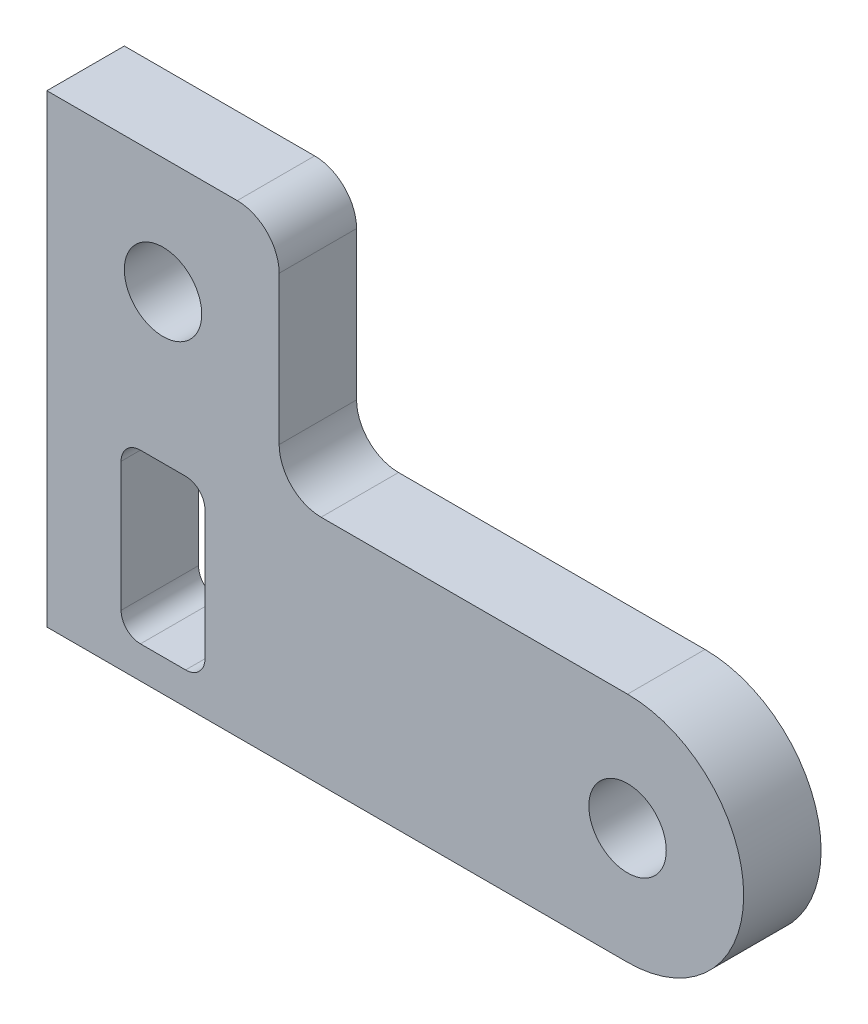
ISO-10303-21;
HEADER;
FILE_DESCRIPTION(('STEP AP214'),'2;1');
FILE_NAME('part.step','',(''),(''),'','','');
FILE_SCHEMA(('AUTOMOTIVE_DESIGN { 1 0 10303 214 1 1 1 1 }'));
ENDSEC;
DATA;
#1=APPLICATION_CONTEXT('core data for automotive mechanical design processes');
#2=APPLICATION_PROTOCOL_DEFINITION('international standard','automotive_design',2000,#1);
#3=PRODUCT_CONTEXT('',#1,'mechanical');
#4=PRODUCT('Part','Part','',(#3));
#5=PRODUCT_RELATED_PRODUCT_CATEGORY('part','',(#4));
#6=PRODUCT_DEFINITION_FORMATION('','',#4);
#7=PRODUCT_DEFINITION_CONTEXT('part definition',#1,'design');
#8=PRODUCT_DEFINITION('design','',#6,#7);
#9=PRODUCT_DEFINITION_SHAPE('','',#8);
#10=(LENGTH_UNIT() NAMED_UNIT(*) SI_UNIT(.MILLI.,.METRE.));
#11=(NAMED_UNIT(*) PLANE_ANGLE_UNIT() SI_UNIT($,.RADIAN.));
#12=(NAMED_UNIT(*) SI_UNIT($,.STERADIAN.) SOLID_ANGLE_UNIT());
#13=UNCERTAINTY_MEASURE_WITH_UNIT(LENGTH_MEASURE(1.E-05),#10,'distance_accuracy_value','');
#14=(GEOMETRIC_REPRESENTATION_CONTEXT(3) GLOBAL_UNCERTAINTY_ASSIGNED_CONTEXT((#13)) GLOBAL_UNIT_ASSIGNED_CONTEXT((#10,
#11,#12)) REPRESENTATION_CONTEXT('',''));
#15=CARTESIAN_POINT('',(0.,0.,0.));
#16=DIRECTION('',(0.,0.,1.));
#17=DIRECTION('',(1.,0.,0.));
#18=AXIS2_PLACEMENT_3D('',#15,#16,#17);
#19=CARTESIAN_POINT('',(201.0978533093,269.1465473352,3.));
#20=DIRECTION('',(0.,0.,1.));
#21=DIRECTION('',(1.,0.,0.));
#22=AXIS2_PLACEMENT_3D('',#19,#20,#21);
#23=PLANE('',#22);
#24=DIRECTION('',(1.,0.,0.));
#25=VECTOR('',#24,1.);
#26=CARTESIAN_POINT('',(182.2228533093,265.8965473352,3.));
#27=LINE('',#26,#25);
#28=CARTESIAN_POINT('',(182.2228533093,265.8965473352,3.));
#29=VERTEX_POINT('',#28);
#30=CARTESIAN_POINT('',(183.9728533093,265.8965473352,3.));
#31=VERTEX_POINT('',#30);
#32=EDGE_CURVE('E154',#29,#31,#27,.T.);
#33=ORIENTED_EDGE('',*,*,#32,.F.);
#34=CARTESIAN_POINT('',(182.2228533093,266.6465473352,3.));
#35=DIRECTION('',(0.,0.,1.));
#36=DIRECTION('',(1.,0.,0.));
#37=AXIS2_PLACEMENT_3D('',#34,#35,#36);
#38=CIRCLE('',#37,0.749999999999987);
#39=CARTESIAN_POINT('',(181.4728533093,266.6465473352,3.));
#40=VERTEX_POINT('',#39);
#41=EDGE_CURVE('E146',#40,#29,#38,.T.);
#42=ORIENTED_EDGE('',*,*,#41,.F.);
#43=DIRECTION('',(0.,-1.,0.));
#44=VECTOR('',#43,1.);
#45=CARTESIAN_POINT('',(181.4728533093,271.6465473352,3.));
#46=LINE('',#45,#44);
#47=CARTESIAN_POINT('',(181.4728533093,271.6465473352,3.));
#48=VERTEX_POINT('',#47);
#49=EDGE_CURVE('E181',#48,#40,#46,.T.);
#50=ORIENTED_EDGE('',*,*,#49,.F.);
#51=CARTESIAN_POINT('',(182.2228533093,271.6465473352,3.));
#52=DIRECTION('',(0.,0.,1.));
#53=DIRECTION('',(1.,0.,0.));
#54=AXIS2_PLACEMENT_3D('',#51,#52,#53);
#55=CIRCLE('',#54,0.750000000000015);
#56=CARTESIAN_POINT('',(182.2228533093,272.3965473352,3.));
#57=VERTEX_POINT('',#56);
#58=EDGE_CURVE('E179',#57,#48,#55,.T.);
#59=ORIENTED_EDGE('',*,*,#58,.F.);
#60=DIRECTION('',(-1.,0.,0.));
#61=VECTOR('',#60,1.);
#62=CARTESIAN_POINT('',(183.9728533093,272.3965473352,3.));
#63=LINE('',#62,#61);
#64=CARTESIAN_POINT('',(183.9728533093,272.3965473352,3.));
#65=VERTEX_POINT('',#64);
#66=EDGE_CURVE('E177',#65,#57,#63,.T.);
#67=ORIENTED_EDGE('',*,*,#66,.F.);
#68=CARTESIAN_POINT('',(183.9728533093,271.6465473352,3.));
#69=DIRECTION('',(0.,0.,1.));
#70=DIRECTION('',(1.,0.,0.));
#71=AXIS2_PLACEMENT_3D('',#68,#69,#70);
#72=CIRCLE('',#71,0.750000000000015);
#73=CARTESIAN_POINT('',(184.7228533093,271.6465473352,3.));
#74=VERTEX_POINT('',#73);
#75=EDGE_CURVE('E175',#74,#65,#72,.T.);
#76=ORIENTED_EDGE('',*,*,#75,.F.);
#77=DIRECTION('',(0.,1.,0.));
#78=VECTOR('',#77,1.);
#79=CARTESIAN_POINT('',(184.7228533093,266.6465473352,3.));
#80=LINE('',#79,#78);
#81=CARTESIAN_POINT('',(184.7228533093,266.6465473352,3.));
#82=VERTEX_POINT('',#81);
#83=EDGE_CURVE('E170',#82,#74,#80,.T.);
#84=ORIENTED_EDGE('',*,*,#83,.F.);
#85=CARTESIAN_POINT('',(183.9728533093,266.6465473352,3.));
#86=DIRECTION('',(0.,0.,1.));
#87=DIRECTION('',(1.,0.,0.));
#88=AXIS2_PLACEMENT_3D('',#85,#86,#87);
#89=CIRCLE('',#88,0.749999999999987);
#90=EDGE_CURVE('E168',#31,#82,#89,.T.);
#91=ORIENTED_EDGE('',*,*,#90,.F.);
#92=EDGE_LOOP('',(#33,#42,#50,#59,#67,#76,#84,#91));
#93=FACE_BOUND('',#92,.T.);
#94=CARTESIAN_POINT('',(201.0978533093,269.1465473352,3.));
#95=DIRECTION('',(0.,0.,1.));
#96=DIRECTION('',(1.,0.,0.));
#97=AXIS2_PLACEMENT_3D('',#94,#95,#96);
#98=CIRCLE('',#97,4.49999999999998);
#99=CARTESIAN_POINT('',(201.0978533093,264.6465473352,3.));
#100=VERTEX_POINT('',#99);
#101=CARTESIAN_POINT('',(201.0978533093,273.6465473352,3.));
#102=VERTEX_POINT('',#101);
#103=EDGE_CURVE('E220',#100,#102,#98,.T.);
#104=ORIENTED_EDGE('',*,*,#103,.T.);
#105=DIRECTION('',(-1.,0.,0.));
#106=VECTOR('',#105,1.);
#107=CARTESIAN_POINT('',(189.2228533093,273.6465473352,3.));
#108=LINE('',#107,#106);
#109=CARTESIAN_POINT('',(189.2228533093,273.6465473352,3.));
#110=VERTEX_POINT('',#109);
#111=EDGE_CURVE('E223',#102,#110,#108,.T.);
#112=ORIENTED_EDGE('',*,*,#111,.T.);
#113=CARTESIAN_POINT('',(189.2228533093,275.2715473352,3.));
#114=DIRECTION('',(0.,0.,-1.));
#115=DIRECTION('',(1.,0.,0.));
#116=AXIS2_PLACEMENT_3D('',#113,#114,#115);
#117=CIRCLE('',#116,1.62500000000002);
#118=CARTESIAN_POINT('',(187.5978533093,275.2715473352,3.));
#119=VERTEX_POINT('',#118);
#120=EDGE_CURVE('E226',#110,#119,#117,.T.);
#121=ORIENTED_EDGE('',*,*,#120,.T.);
#122=DIRECTION('',(0.,1.,0.));
#123=VECTOR('',#122,1.);
#124=CARTESIAN_POINT('',(187.5978533093,281.0215473352,3.));
#125=LINE('',#124,#123);
#126=CARTESIAN_POINT('',(187.5978533093,281.0215473352,3.));
#127=VERTEX_POINT('',#126);
#128=EDGE_CURVE('E228',#119,#127,#125,.T.);
#129=ORIENTED_EDGE('',*,*,#128,.T.);
#130=CARTESIAN_POINT('',(185.9728533093,281.0215473352,3.));
#131=DIRECTION('',(0.,0.,1.));
#132=DIRECTION('',(1.,0.,0.));
#133=AXIS2_PLACEMENT_3D('',#130,#131,#132);
#134=CIRCLE('',#133,1.62499999999999);
#135=CARTESIAN_POINT('',(185.9728533093,282.6465473352,3.));
#136=VERTEX_POINT('',#135);
#137=EDGE_CURVE('E230',#127,#136,#134,.T.);
#138=ORIENTED_EDGE('',*,*,#137,.T.);
#139=DIRECTION('',(-1.,0.,0.));
#140=VECTOR('',#139,1.);
#141=CARTESIAN_POINT('',(185.9728533093,282.6465473352,3.));
#142=LINE('',#141,#140);
#143=CARTESIAN_POINT('',(178.5978533093,282.6465473352,3.));
#144=VERTEX_POINT('',#143);
#145=EDGE_CURVE('E232',#136,#144,#142,.T.);
#146=ORIENTED_EDGE('',*,*,#145,.T.);
#147=DIRECTION('',(0.,-1.,0.));
#148=VECTOR('',#147,1.);
#149=CARTESIAN_POINT('',(178.5978533093,282.6465473352,3.));
#150=LINE('',#149,#148);
#151=CARTESIAN_POINT('',(178.5978533093,264.6465473352,3.));
#152=VERTEX_POINT('',#151);
#153=EDGE_CURVE('E234',#144,#152,#150,.T.);
#154=ORIENTED_EDGE('',*,*,#153,.T.);
#155=DIRECTION('',(1.,0.,0.));
#156=VECTOR('',#155,1.);
#157=CARTESIAN_POINT('',(201.0978533093,264.6465473352,3.));
#158=LINE('',#157,#156);
#159=EDGE_CURVE('E236',#152,#100,#158,.T.);
#160=ORIENTED_EDGE('',*,*,#159,.T.);
#161=EDGE_LOOP('',(#104,#112,#121,#129,#138,#146,#154,#160));
#162=FACE_BOUND('',#161,.T.);
#163=CARTESIAN_POINT('',(201.0978533093,269.1465473352,3.));
#164=DIRECTION('',(0.,0.,1.));
#165=DIRECTION('',(1.,0.,0.));
#166=AXIS2_PLACEMENT_3D('',#163,#164,#165);
#167=CIRCLE('',#166,1.5);
#168=CARTESIAN_POINT('',(202.5978533093,269.1465473352,3.));
#169=VERTEX_POINT('',#168);
#170=EDGE_CURVE('E214',#169,#169,#167,.T.);
#171=ORIENTED_EDGE('',*,*,#170,.F.);
#172=EDGE_LOOP('',(#171));
#173=FACE_BOUND('',#172,.T.);
#174=CARTESIAN_POINT('',(183.0978533093,278.1459687639,3.));
#175=DIRECTION('',(0.,0.,1.));
#176=DIRECTION('',(1.,0.,0.));
#177=AXIS2_PLACEMENT_3D('',#174,#175,#176);
#178=CIRCLE('',#177,1.5);
#179=CARTESIAN_POINT('',(184.5978533093,278.1459687639,3.));
#180=VERTEX_POINT('',#179);
#181=EDGE_CURVE('E184',#180,#180,#178,.T.);
#182=ORIENTED_EDGE('',*,*,#181,.F.);
#183=EDGE_LOOP('',(#182));
#184=FACE_BOUND('',#183,.T.);
#185=ADVANCED_FACE('F33',(#93,#162,#173,#184),#23,.T.);
#186=CARTESIAN_POINT('',(201.0978533093,269.1465473352,0.));
#187=DIRECTION('',(0.,0.,1.));
#188=DIRECTION('',(1.,0.,0.));
#189=AXIS2_PLACEMENT_3D('',#186,#187,#188);
#190=PLANE('',#189);
#191=CARTESIAN_POINT('',(182.2228533093,266.6465473352,0.));
#192=DIRECTION('',(0.,0.,1.));
#193=DIRECTION('',(1.,0.,0.));
#194=AXIS2_PLACEMENT_3D('',#191,#192,#193);
#195=CIRCLE('',#194,0.749999999999987);
#196=CARTESIAN_POINT('',(181.4728533093,266.6465473352,0.));
#197=VERTEX_POINT('',#196);
#198=CARTESIAN_POINT('',(182.2228533093,265.8965473352,0.));
#199=VERTEX_POINT('',#198);
#200=EDGE_CURVE('E56',#197,#199,#195,.T.);
#201=ORIENTED_EDGE('',*,*,#200,.T.);
#202=DIRECTION('',(1.,0.,0.));
#203=VECTOR('',#202,1.);
#204=CARTESIAN_POINT('',(182.2228533093,265.8965473352,0.));
#205=LINE('',#204,#203);
#206=CARTESIAN_POINT('',(183.9728533093,265.8965473352,0.));
#207=VERTEX_POINT('',#206);
#208=EDGE_CURVE('E161',#199,#207,#205,.T.);
#209=ORIENTED_EDGE('',*,*,#208,.T.);
#210=CARTESIAN_POINT('',(183.9728533093,266.6465473352,0.));
#211=DIRECTION('',(0.,0.,1.));
#212=DIRECTION('',(1.,0.,0.));
#213=AXIS2_PLACEMENT_3D('',#210,#211,#212);
#214=CIRCLE('',#213,0.749999999999987);
#215=CARTESIAN_POINT('',(184.7228533093,266.6465473352,0.));
#216=VERTEX_POINT('',#215);
#217=EDGE_CURVE('E186',#207,#216,#214,.T.);
#218=ORIENTED_EDGE('',*,*,#217,.T.);
#219=DIRECTION('',(0.,1.,0.));
#220=VECTOR('',#219,1.);
#221=CARTESIAN_POINT('',(184.7228533093,266.6465473352,0.));
#222=LINE('',#221,#220);
#223=CARTESIAN_POINT('',(184.7228533093,271.6465473352,0.));
#224=VERTEX_POINT('',#223);
#225=EDGE_CURVE('E189',#216,#224,#222,.T.);
#226=ORIENTED_EDGE('',*,*,#225,.T.);
#227=CARTESIAN_POINT('',(183.9728533093,271.6465473352,0.));
#228=DIRECTION('',(0.,0.,1.));
#229=DIRECTION('',(1.,0.,0.));
#230=AXIS2_PLACEMENT_3D('',#227,#228,#229);
#231=CIRCLE('',#230,0.750000000000015);
#232=CARTESIAN_POINT('',(183.9728533093,272.3965473352,0.));
#233=VERTEX_POINT('',#232);
#234=EDGE_CURVE('E192',#224,#233,#231,.T.);
#235=ORIENTED_EDGE('',*,*,#234,.T.);
#236=DIRECTION('',(-1.,0.,0.));
#237=VECTOR('',#236,1.);
#238=CARTESIAN_POINT('',(183.9728533093,272.3965473352,0.));
#239=LINE('',#238,#237);
#240=CARTESIAN_POINT('',(182.2228533093,272.3965473352,0.));
#241=VERTEX_POINT('',#240);
#242=EDGE_CURVE('E195',#233,#241,#239,.T.);
#243=ORIENTED_EDGE('',*,*,#242,.T.);
#244=CARTESIAN_POINT('',(182.2228533093,271.6465473352,0.));
#245=DIRECTION('',(0.,0.,1.));
#246=DIRECTION('',(1.,0.,0.));
#247=AXIS2_PLACEMENT_3D('',#244,#245,#246);
#248=CIRCLE('',#247,0.750000000000015);
#249=CARTESIAN_POINT('',(181.4728533093,271.6465473352,0.));
#250=VERTEX_POINT('',#249);
#251=EDGE_CURVE('E198',#241,#250,#248,.T.);
#252=ORIENTED_EDGE('',*,*,#251,.T.);
#253=DIRECTION('',(0.,-1.,0.));
#254=VECTOR('',#253,1.);
#255=CARTESIAN_POINT('',(181.4728533093,271.6465473352,0.));
#256=LINE('',#255,#254);
#257=EDGE_CURVE('E155',#250,#197,#256,.T.);
#258=ORIENTED_EDGE('',*,*,#257,.T.);
#259=EDGE_LOOP('',(#201,#209,#218,#226,#235,#243,#252,#258));
#260=FACE_BOUND('',#259,.T.);
#261=CARTESIAN_POINT('',(201.0978533093,269.1465473352,0.));
#262=DIRECTION('',(0.,0.,1.));
#263=DIRECTION('',(1.,0.,0.));
#264=AXIS2_PLACEMENT_3D('',#261,#262,#263);
#265=CIRCLE('',#264,4.49999999999998);
#266=CARTESIAN_POINT('',(201.0978533093,264.6465473352,0.));
#267=VERTEX_POINT('',#266);
#268=CARTESIAN_POINT('',(201.0978533093,273.6465473352,0.));
#269=VERTEX_POINT('',#268);
#270=EDGE_CURVE('E217',#267,#269,#265,.T.);
#271=ORIENTED_EDGE('',*,*,#270,.F.);
#272=DIRECTION('',(1.,0.,0.));
#273=VECTOR('',#272,1.);
#274=CARTESIAN_POINT('',(201.0978533093,264.6465473352,0.));
#275=LINE('',#274,#273);
#276=CARTESIAN_POINT('',(178.5978533093,264.6465473352,0.));
#277=VERTEX_POINT('',#276);
#278=EDGE_CURVE('E224',#277,#267,#275,.T.);
#279=ORIENTED_EDGE('',*,*,#278,.F.);
#280=DIRECTION('',(0.,-1.,0.));
#281=VECTOR('',#280,1.);
#282=CARTESIAN_POINT('',(178.5978533093,282.6465473352,0.));
#283=LINE('',#282,#281);
#284=CARTESIAN_POINT('',(178.5978533093,282.6465473352,0.));
#285=VERTEX_POINT('',#284);
#286=EDGE_CURVE('E251',#285,#277,#283,.T.);
#287=ORIENTED_EDGE('',*,*,#286,.F.);
#288=DIRECTION('',(-1.,0.,0.));
#289=VECTOR('',#288,1.);
#290=CARTESIAN_POINT('',(185.9728533093,282.6465473352,0.));
#291=LINE('',#290,#289);
#292=CARTESIAN_POINT('',(185.9728533093,282.6465473352,0.));
#293=VERTEX_POINT('',#292);
#294=EDGE_CURVE('E249',#293,#285,#291,.T.);
#295=ORIENTED_EDGE('',*,*,#294,.F.);
#296=CARTESIAN_POINT('',(185.9728533093,281.0215473352,0.));
#297=DIRECTION('',(0.,0.,1.));
#298=DIRECTION('',(1.,0.,0.));
#299=AXIS2_PLACEMENT_3D('',#296,#297,#298);
#300=CIRCLE('',#299,1.62499999999999);
#301=CARTESIAN_POINT('',(187.5978533093,281.0215473352,0.));
#302=VERTEX_POINT('',#301);
#303=EDGE_CURVE('E247',#302,#293,#300,.T.);
#304=ORIENTED_EDGE('',*,*,#303,.F.);
#305=DIRECTION('',(0.,1.,0.));
#306=VECTOR('',#305,1.);
#307=CARTESIAN_POINT('',(187.5978533093,281.0215473352,0.));
#308=LINE('',#307,#306);
#309=CARTESIAN_POINT('',(187.5978533093,275.2715473352,0.));
#310=VERTEX_POINT('',#309);
#311=EDGE_CURVE('E245',#310,#302,#308,.T.);
#312=ORIENTED_EDGE('',*,*,#311,.F.);
#313=CARTESIAN_POINT('',(189.2228533093,275.2715473352,0.));
#314=DIRECTION('',(0.,0.,-1.));
#315=DIRECTION('',(1.,0.,0.));
#316=AXIS2_PLACEMENT_3D('',#313,#314,#315);
#317=CIRCLE('',#316,1.62500000000002);
#318=CARTESIAN_POINT('',(189.2228533093,273.6465473352,0.));
#319=VERTEX_POINT('',#318);
#320=EDGE_CURVE('E243',#319,#310,#317,.T.);
#321=ORIENTED_EDGE('',*,*,#320,.F.);
#322=DIRECTION('',(-1.,0.,0.));
#323=VECTOR('',#322,1.);
#324=CARTESIAN_POINT('',(189.2228533093,273.6465473352,0.));
#325=LINE('',#324,#323);
#326=EDGE_CURVE('E241',#269,#319,#325,.T.);
#327=ORIENTED_EDGE('',*,*,#326,.F.);
#328=EDGE_LOOP('',(#271,#279,#287,#295,#304,#312,#321,#327));
#329=FACE_BOUND('',#328,.T.);
#330=CARTESIAN_POINT('',(201.0978533093,269.1465473352,0.));
#331=DIRECTION('',(0.,0.,1.));
#332=DIRECTION('',(1.,0.,0.));
#333=AXIS2_PLACEMENT_3D('',#330,#331,#332);
#334=CIRCLE('',#333,1.5);
#335=CARTESIAN_POINT('',(202.5978533093,269.1465473352,0.));
#336=VERTEX_POINT('',#335);
#337=EDGE_CURVE('E162',#336,#336,#334,.T.);
#338=ORIENTED_EDGE('',*,*,#337,.T.);
#339=EDGE_LOOP('',(#338));
#340=FACE_BOUND('',#339,.T.);
#341=CARTESIAN_POINT('',(183.0978533093,278.1459687639,0.));
#342=DIRECTION('',(0.,0.,1.));
#343=DIRECTION('',(1.,0.,0.));
#344=AXIS2_PLACEMENT_3D('',#341,#342,#343);
#345=CIRCLE('',#344,1.5);
#346=CARTESIAN_POINT('',(184.5978533093,278.1459687639,0.));
#347=VERTEX_POINT('',#346);
#348=EDGE_CURVE('E345',#347,#347,#345,.T.);
#349=ORIENTED_EDGE('',*,*,#348,.T.);
#350=EDGE_LOOP('',(#349));
#351=FACE_BOUND('',#350,.T.);
#352=ADVANCED_FACE('F281',(#260,#329,#340,#351),#190,.F.);
#353=CARTESIAN_POINT('',(201.0978533093,269.1465473352,3.));
#354=DIRECTION('',(0.,0.,-1.));
#355=DIRECTION('',(-1.,0.,0.));
#356=AXIS2_PLACEMENT_3D('',#353,#354,#355);
#357=CYLINDRICAL_SURFACE('',#356,4.49999999999998);
#358=ORIENTED_EDGE('',*,*,#270,.T.);
#359=DIRECTION('',(0.,0.,-1.));
#360=VECTOR('',#359,1.);
#361=CARTESIAN_POINT('',(201.0978533093,273.6465473352,3.));
#362=LINE('',#361,#360);
#363=EDGE_CURVE('E11',#102,#269,#362,.T.);
#364=ORIENTED_EDGE('',*,*,#363,.F.);
#365=ORIENTED_EDGE('',*,*,#103,.F.);
#366=DIRECTION('',(0.,0.,-1.));
#367=VECTOR('',#366,1.);
#368=CARTESIAN_POINT('',(201.0978533093,264.6465473352,3.));
#369=LINE('',#368,#367);
#370=EDGE_CURVE('E238',#100,#267,#369,.T.);
#371=ORIENTED_EDGE('',*,*,#370,.T.);
#372=EDGE_LOOP('',(#358,#364,#365,#371));
#373=FACE_BOUND('',#372,.T.);
#374=ADVANCED_FACE('F35',(#373),#357,.T.);
#375=CARTESIAN_POINT('',(189.2228533093,273.6465473352,3.));
#376=DIRECTION('',(0.,-1.,0.));
#377=DIRECTION('',(0.,0.,-1.));
#378=AXIS2_PLACEMENT_3D('',#375,#376,#377);
#379=PLANE('',#378);
#380=ORIENTED_EDGE('',*,*,#326,.T.);
#381=DIRECTION('',(0.,0.,-1.));
#382=VECTOR('',#381,1.);
#383=CARTESIAN_POINT('',(189.2228533093,273.6465473352,3.));
#384=LINE('',#383,#382);
#385=EDGE_CURVE('E41',#110,#319,#384,.T.);
#386=ORIENTED_EDGE('',*,*,#385,.F.);
#387=ORIENTED_EDGE('',*,*,#111,.F.);
#388=ORIENTED_EDGE('',*,*,#363,.T.);
#389=EDGE_LOOP('',(#380,#386,#387,#388));
#390=FACE_BOUND('',#389,.T.);
#391=ADVANCED_FACE('F298',(#390),#379,.F.);
#392=CARTESIAN_POINT('',(189.2228533093,275.2715473352,3.));
#393=DIRECTION('',(0.,0.,-1.));
#394=DIRECTION('',(-1.,0.,0.));
#395=AXIS2_PLACEMENT_3D('',#392,#393,#394);
#396=CYLINDRICAL_SURFACE('',#395,1.62500000000002);
#397=ORIENTED_EDGE('',*,*,#320,.T.);
#398=DIRECTION('',(0.,0.,-1.));
#399=VECTOR('',#398,1.);
#400=CARTESIAN_POINT('',(187.5978533093,275.2715473352,3.));
#401=LINE('',#400,#399);
#402=EDGE_CURVE('E268',#119,#310,#401,.T.);
#403=ORIENTED_EDGE('',*,*,#402,.F.);
#404=ORIENTED_EDGE('',*,*,#120,.F.);
#405=ORIENTED_EDGE('',*,*,#385,.T.);
#406=EDGE_LOOP('',(#397,#403,#404,#405));
#407=FACE_BOUND('',#406,.T.);
#408=ADVANCED_FACE('F275',(#407),#396,.F.);
#409=CARTESIAN_POINT('',(187.5978533093,281.0215473352,3.));
#410=DIRECTION('',(-1.,0.,0.));
#411=DIRECTION('',(0.,0.,1.));
#412=AXIS2_PLACEMENT_3D('',#409,#410,#411);
#413=PLANE('',#412);
#414=ORIENTED_EDGE('',*,*,#311,.T.);
#415=DIRECTION('',(0.,0.,-1.));
#416=VECTOR('',#415,1.);
#417=CARTESIAN_POINT('',(187.5978533093,281.0215473352,3.));
#418=LINE('',#417,#416);
#419=EDGE_CURVE('E265',#127,#302,#418,.T.);
#420=ORIENTED_EDGE('',*,*,#419,.F.);
#421=ORIENTED_EDGE('',*,*,#128,.F.);
#422=ORIENTED_EDGE('',*,*,#402,.T.);
#423=EDGE_LOOP('',(#414,#420,#421,#422));
#424=FACE_BOUND('',#423,.T.);
#425=ADVANCED_FACE('F287',(#424),#413,.F.);
#426=CARTESIAN_POINT('',(185.9728533093,281.0215473352,3.));
#427=DIRECTION('',(0.,0.,-1.));
#428=DIRECTION('',(-1.,0.,0.));
#429=AXIS2_PLACEMENT_3D('',#426,#427,#428);
#430=CYLINDRICAL_SURFACE('',#429,1.62499999999999);
#431=ORIENTED_EDGE('',*,*,#303,.T.);
#432=DIRECTION('',(0.,0.,-1.));
#433=VECTOR('',#432,1.);
#434=CARTESIAN_POINT('',(185.9728533093,282.6465473352,3.));
#435=LINE('',#434,#433);
#436=EDGE_CURVE('E262',#136,#293,#435,.T.);
#437=ORIENTED_EDGE('',*,*,#436,.F.);
#438=ORIENTED_EDGE('',*,*,#137,.F.);
#439=ORIENTED_EDGE('',*,*,#419,.T.);
#440=EDGE_LOOP('',(#431,#437,#438,#439));
#441=FACE_BOUND('',#440,.T.);
#442=ADVANCED_FACE('F291',(#441),#430,.T.);
#443=CARTESIAN_POINT('',(185.9728533093,282.6465473352,3.));
#444=DIRECTION('',(0.,-1.,0.));
#445=DIRECTION('',(0.,0.,-1.));
#446=AXIS2_PLACEMENT_3D('',#443,#444,#445);
#447=PLANE('',#446);
#448=ORIENTED_EDGE('',*,*,#294,.T.);
#449=DIRECTION('',(0.,0.,-1.));
#450=VECTOR('',#449,1.);
#451=CARTESIAN_POINT('',(178.5978533093,282.6465473352,3.));
#452=LINE('',#451,#450);
#453=EDGE_CURVE('E259',#144,#285,#452,.T.);
#454=ORIENTED_EDGE('',*,*,#453,.F.);
#455=ORIENTED_EDGE('',*,*,#145,.F.);
#456=ORIENTED_EDGE('',*,*,#436,.T.);
#457=EDGE_LOOP('',(#448,#454,#455,#456));
#458=FACE_BOUND('',#457,.T.);
#459=ADVANCED_FACE('F311',(#458),#447,.F.);
#460=CARTESIAN_POINT('',(178.5978533093,282.6465473352,3.));
#461=DIRECTION('',(1.,0.,0.));
#462=DIRECTION('',(0.,0.,-1.));
#463=AXIS2_PLACEMENT_3D('',#460,#461,#462);
#464=PLANE('',#463);
#465=ORIENTED_EDGE('',*,*,#286,.T.);
#466=DIRECTION('',(0.,0.,-1.));
#467=VECTOR('',#466,1.);
#468=CARTESIAN_POINT('',(178.5978533093,264.6465473352,3.));
#469=LINE('',#468,#467);
#470=EDGE_CURVE('E256',#152,#277,#469,.T.);
#471=ORIENTED_EDGE('',*,*,#470,.F.);
#472=ORIENTED_EDGE('',*,*,#153,.F.);
#473=ORIENTED_EDGE('',*,*,#453,.T.);
#474=EDGE_LOOP('',(#465,#471,#472,#473));
#475=FACE_BOUND('',#474,.T.);
#476=ADVANCED_FACE('F309',(#475),#464,.F.);
#477=CARTESIAN_POINT('',(201.0978533093,264.6465473352,3.));
#478=DIRECTION('',(0.,1.,0.));
#479=DIRECTION('',(0.,0.,1.));
#480=AXIS2_PLACEMENT_3D('',#477,#478,#479);
#481=PLANE('',#480);
#482=ORIENTED_EDGE('',*,*,#278,.T.);
#483=ORIENTED_EDGE('',*,*,#370,.F.);
#484=ORIENTED_EDGE('',*,*,#159,.F.);
#485=ORIENTED_EDGE('',*,*,#470,.T.);
#486=EDGE_LOOP('',(#482,#483,#484,#485));
#487=FACE_BOUND('',#486,.T.);
#488=ADVANCED_FACE('F304',(#487),#481,.F.);
#489=CARTESIAN_POINT('',(201.0978533093,269.1465473352,3.));
#490=DIRECTION('',(0.,0.,-1.));
#491=DIRECTION('',(-1.,0.,0.));
#492=AXIS2_PLACEMENT_3D('',#489,#490,#491);
#493=CYLINDRICAL_SURFACE('',#492,1.5);
#494=ORIENTED_EDGE('',*,*,#170,.T.);
#495=EDGE_LOOP('',(#494));
#496=FACE_BOUND('',#495,.T.);
#497=ORIENTED_EDGE('',*,*,#337,.F.);
#498=EDGE_LOOP('',(#497));
#499=FACE_BOUND('',#498,.T.);
#500=ADVANCED_FACE('F328',(#496,#499),#493,.F.);
#501=CARTESIAN_POINT('',(182.2228533093,266.6465473352,3.));
#502=DIRECTION('',(0.,0.,-1.));
#503=DIRECTION('',(-1.,0.,0.));
#504=AXIS2_PLACEMENT_3D('',#501,#502,#503);
#505=CYLINDRICAL_SURFACE('',#504,0.749999999999987);
#506=ORIENTED_EDGE('',*,*,#200,.F.);
#507=DIRECTION('',(0.,0.,-1.));
#508=VECTOR('',#507,1.);
#509=CARTESIAN_POINT('',(181.4728533093,266.6465473352,3.));
#510=LINE('',#509,#508);
#511=EDGE_CURVE('E150',#40,#197,#510,.T.);
#512=ORIENTED_EDGE('',*,*,#511,.F.);
#513=ORIENTED_EDGE('',*,*,#41,.T.);
#514=DIRECTION('',(0.,0.,-1.));
#515=VECTOR('',#514,1.);
#516=CARTESIAN_POINT('',(182.2228533093,265.8965473352,3.));
#517=LINE('',#516,#515);
#518=EDGE_CURVE('E149',#29,#199,#517,.T.);
#519=ORIENTED_EDGE('',*,*,#518,.T.);
#520=EDGE_LOOP('',(#506,#512,#513,#519));
#521=FACE_BOUND('',#520,.T.);
#522=ADVANCED_FACE('F148',(#521),#505,.F.);
#523=CARTESIAN_POINT('',(182.2228533093,265.8965473352,3.));
#524=DIRECTION('',(0.,1.,0.));
#525=DIRECTION('',(0.,0.,1.));
#526=AXIS2_PLACEMENT_3D('',#523,#524,#525);
#527=PLANE('',#526);
#528=ORIENTED_EDGE('',*,*,#208,.F.);
#529=ORIENTED_EDGE('',*,*,#518,.F.);
#530=ORIENTED_EDGE('',*,*,#32,.T.);
#531=DIRECTION('',(0.,0.,-1.));
#532=VECTOR('',#531,1.);
#533=CARTESIAN_POINT('',(183.9728533093,265.8965473352,3.));
#534=LINE('',#533,#532);
#535=EDGE_CURVE('E163',#31,#207,#534,.T.);
#536=ORIENTED_EDGE('',*,*,#535,.T.);
#537=EDGE_LOOP('',(#528,#529,#530,#536));
#538=FACE_BOUND('',#537,.T.);
#539=ADVANCED_FACE('F158',(#538),#527,.T.);
#540=CARTESIAN_POINT('',(183.9728533093,266.6465473352,3.));
#541=DIRECTION('',(0.,0.,-1.));
#542=DIRECTION('',(-1.,0.,0.));
#543=AXIS2_PLACEMENT_3D('',#540,#541,#542);
#544=CYLINDRICAL_SURFACE('',#543,0.749999999999987);
#545=ORIENTED_EDGE('',*,*,#217,.F.);
#546=ORIENTED_EDGE('',*,*,#535,.F.);
#547=ORIENTED_EDGE('',*,*,#90,.T.);
#548=DIRECTION('',(0.,0.,-1.));
#549=VECTOR('',#548,1.);
#550=CARTESIAN_POINT('',(184.7228533093,266.6465473352,3.));
#551=LINE('',#550,#549);
#552=EDGE_CURVE('E211',#82,#216,#551,.T.);
#553=ORIENTED_EDGE('',*,*,#552,.T.);
#554=EDGE_LOOP('',(#545,#546,#547,#553));
#555=FACE_BOUND('',#554,.T.);
#556=ADVANCED_FACE('F376',(#555),#544,.F.);
#557=CARTESIAN_POINT('',(184.7228533093,266.6465473352,3.));
#558=DIRECTION('',(-1.,0.,0.));
#559=DIRECTION('',(0.,0.,1.));
#560=AXIS2_PLACEMENT_3D('',#557,#558,#559);
#561=PLANE('',#560);
#562=ORIENTED_EDGE('',*,*,#225,.F.);
#563=ORIENTED_EDGE('',*,*,#552,.F.);
#564=ORIENTED_EDGE('',*,*,#83,.T.);
#565=DIRECTION('',(0.,0.,-1.));
#566=VECTOR('',#565,1.);
#567=CARTESIAN_POINT('',(184.7228533093,271.6465473352,3.));
#568=LINE('',#567,#566);
#569=EDGE_CURVE('E209',#74,#224,#568,.T.);
#570=ORIENTED_EDGE('',*,*,#569,.T.);
#571=EDGE_LOOP('',(#562,#563,#564,#570));
#572=FACE_BOUND('',#571,.T.);
#573=ADVANCED_FACE('F372',(#572),#561,.T.);
#574=CARTESIAN_POINT('',(183.9728533093,271.6465473352,3.));
#575=DIRECTION('',(0.,0.,-1.));
#576=DIRECTION('',(-1.,0.,0.));
#577=AXIS2_PLACEMENT_3D('',#574,#575,#576);
#578=CYLINDRICAL_SURFACE('',#577,0.750000000000015);
#579=ORIENTED_EDGE('',*,*,#234,.F.);
#580=ORIENTED_EDGE('',*,*,#569,.F.);
#581=ORIENTED_EDGE('',*,*,#75,.T.);
#582=DIRECTION('',(0.,0.,-1.));
#583=VECTOR('',#582,1.);
#584=CARTESIAN_POINT('',(183.9728533093,272.3965473352,3.));
#585=LINE('',#584,#583);
#586=EDGE_CURVE('E207',#65,#233,#585,.T.);
#587=ORIENTED_EDGE('',*,*,#586,.T.);
#588=EDGE_LOOP('',(#579,#580,#581,#587));
#589=FACE_BOUND('',#588,.T.);
#590=ADVANCED_FACE('F368',(#589),#578,.F.);
#591=CARTESIAN_POINT('',(183.9728533093,272.3965473352,3.));
#592=DIRECTION('',(0.,-1.,0.));
#593=DIRECTION('',(0.,0.,-1.));
#594=AXIS2_PLACEMENT_3D('',#591,#592,#593);
#595=PLANE('',#594);
#596=ORIENTED_EDGE('',*,*,#242,.F.);
#597=ORIENTED_EDGE('',*,*,#586,.F.);
#598=ORIENTED_EDGE('',*,*,#66,.T.);
#599=DIRECTION('',(0.,0.,-1.));
#600=VECTOR('',#599,1.);
#601=CARTESIAN_POINT('',(182.2228533093,272.3965473352,3.));
#602=LINE('',#601,#600);
#603=EDGE_CURVE('E205',#57,#241,#602,.T.);
#604=ORIENTED_EDGE('',*,*,#603,.T.);
#605=EDGE_LOOP('',(#596,#597,#598,#604));
#606=FACE_BOUND('',#605,.T.);
#607=ADVANCED_FACE('F364',(#606),#595,.T.);
#608=CARTESIAN_POINT('',(182.2228533093,271.6465473352,3.));
#609=DIRECTION('',(0.,0.,-1.));
#610=DIRECTION('',(-1.,0.,0.));
#611=AXIS2_PLACEMENT_3D('',#608,#609,#610);
#612=CYLINDRICAL_SURFACE('',#611,0.750000000000015);
#613=ORIENTED_EDGE('',*,*,#251,.F.);
#614=ORIENTED_EDGE('',*,*,#603,.F.);
#615=ORIENTED_EDGE('',*,*,#58,.T.);
#616=DIRECTION('',(0.,0.,-1.));
#617=VECTOR('',#616,1.);
#618=CARTESIAN_POINT('',(181.4728533093,271.6465473352,3.));
#619=LINE('',#618,#617);
#620=EDGE_CURVE('E48',#48,#250,#619,.T.);
#621=ORIENTED_EDGE('',*,*,#620,.T.);
#622=EDGE_LOOP('',(#613,#614,#615,#621));
#623=FACE_BOUND('',#622,.T.);
#624=ADVANCED_FACE('F359',(#623),#612,.F.);
#625=CARTESIAN_POINT('',(181.4728533093,271.6465473352,3.));
#626=DIRECTION('',(1.,0.,0.));
#627=DIRECTION('',(0.,0.,-1.));
#628=AXIS2_PLACEMENT_3D('',#625,#626,#627);
#629=PLANE('',#628);
#630=ORIENTED_EDGE('',*,*,#257,.F.);
#631=ORIENTED_EDGE('',*,*,#620,.F.);
#632=ORIENTED_EDGE('',*,*,#49,.T.);
#633=ORIENTED_EDGE('',*,*,#511,.T.);
#634=EDGE_LOOP('',(#630,#631,#632,#633));
#635=FACE_BOUND('',#634,.T.);
#636=ADVANCED_FACE('F354',(#635),#629,.T.);
#637=CARTESIAN_POINT('',(183.0978533093,278.1459687639,3.));
#638=DIRECTION('',(0.,0.,-1.));
#639=DIRECTION('',(-1.,0.,0.));
#640=AXIS2_PLACEMENT_3D('',#637,#638,#639);
#641=CYLINDRICAL_SURFACE('',#640,1.5);
#642=ORIENTED_EDGE('',*,*,#181,.T.);
#643=EDGE_LOOP('',(#642));
#644=FACE_BOUND('',#643,.T.);
#645=ORIENTED_EDGE('',*,*,#348,.F.);
#646=EDGE_LOOP('',(#645));
#647=FACE_BOUND('',#646,.T.);
#648=ADVANCED_FACE('F351',(#644,#647),#641,.F.);
#649=CLOSED_SHELL('',(#185,#352,#374,#391,#408,#425,#442,#459,#476,#488,#500,#522,#539,#556,
#573,#590,#607,#624,#636,#648));
#650=MANIFOLD_SOLID_BREP('B2',#649);
#651=ADVANCED_BREP_SHAPE_REPRESENTATION('',(#18,#650),#14);
#652=SHAPE_DEFINITION_REPRESENTATION(#9,#651);
ENDSEC;
END-ISO-10303-21;
